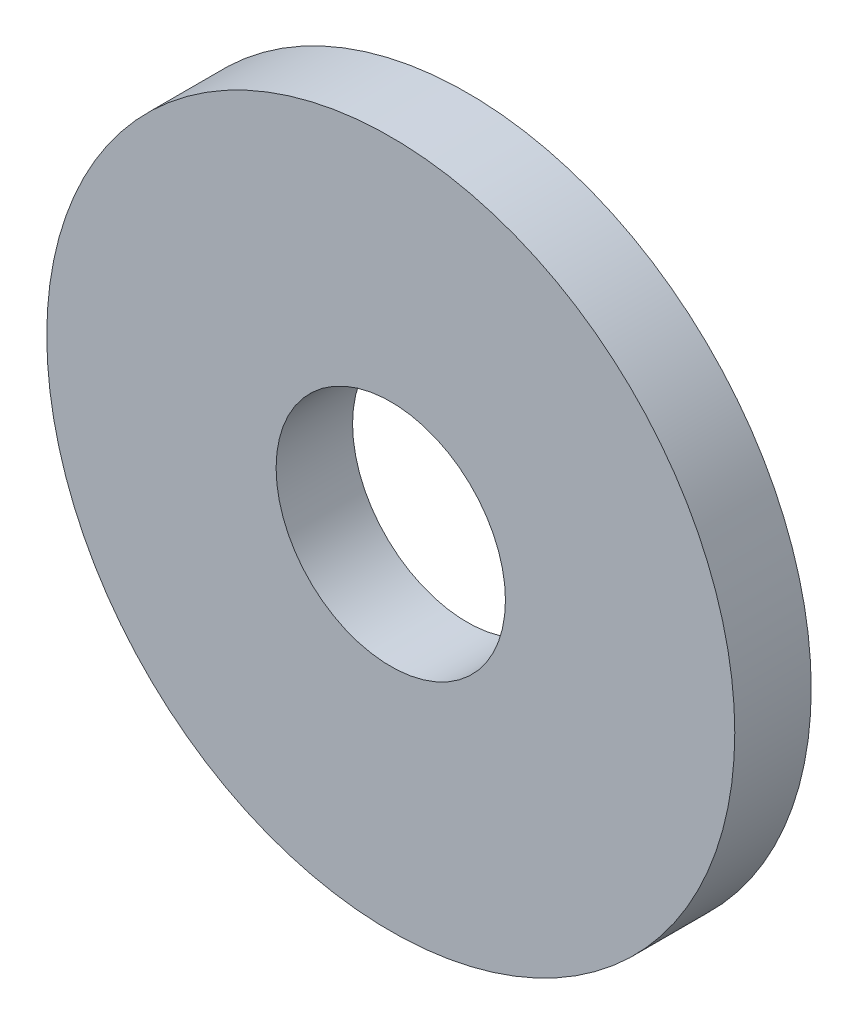
ISO-10303-21;
HEADER;
FILE_DESCRIPTION(('STEP AP214'),'2;1');
FILE_NAME('part.step','',(''),(''),'','','');
FILE_SCHEMA(('AUTOMOTIVE_DESIGN { 1 0 10303 214 1 1 1 1 }'));
ENDSEC;
DATA;
#1=APPLICATION_CONTEXT('core data for automotive mechanical design processes');
#2=APPLICATION_PROTOCOL_DEFINITION('international standard','automotive_design',2000,#1);
#3=PRODUCT_CONTEXT('',#1,'mechanical');
#4=PRODUCT('Part','Part','',(#3));
#5=PRODUCT_RELATED_PRODUCT_CATEGORY('part','',(#4));
#6=PRODUCT_DEFINITION_FORMATION('','',#4);
#7=PRODUCT_DEFINITION_CONTEXT('part definition',#1,'design');
#8=PRODUCT_DEFINITION('design','',#6,#7);
#9=PRODUCT_DEFINITION_SHAPE('','',#8);
#10=(LENGTH_UNIT() NAMED_UNIT(*) SI_UNIT(.MILLI.,.METRE.));
#11=(NAMED_UNIT(*) PLANE_ANGLE_UNIT() SI_UNIT($,.RADIAN.));
#12=(NAMED_UNIT(*) SI_UNIT($,.STERADIAN.) SOLID_ANGLE_UNIT());
#13=UNCERTAINTY_MEASURE_WITH_UNIT(LENGTH_MEASURE(1.E-05),#10,'distance_accuracy_value','');
#14=(GEOMETRIC_REPRESENTATION_CONTEXT(3) GLOBAL_UNCERTAINTY_ASSIGNED_CONTEXT((#13)) GLOBAL_UNIT_ASSIGNED_CONTEXT((#10,
#11,#12)) REPRESENTATION_CONTEXT('',''));
#15=CARTESIAN_POINT('',(0.,0.,0.));
#16=DIRECTION('',(0.,0.,1.));
#17=DIRECTION('',(1.,0.,0.));
#18=AXIS2_PLACEMENT_3D('',#15,#16,#17);
#19=CARTESIAN_POINT('',(0.,0.,0.5));
#20=DIRECTION('',(0.,0.,1.));
#21=DIRECTION('',(1.,0.,0.));
#22=AXIS2_PLACEMENT_3D('',#19,#20,#21);
#23=PLANE('',#22);
#24=CARTESIAN_POINT('',(0.,0.,0.5));
#25=DIRECTION('',(0.,0.,1.));
#26=DIRECTION('',(1.,0.,0.));
#27=AXIS2_PLACEMENT_3D('',#24,#25,#26);
#28=CIRCLE('',#27,4.5);
#29=CARTESIAN_POINT('',(4.5,0.,0.5));
#30=VERTEX_POINT('',#29);
#31=EDGE_CURVE('E10',#30,#30,#28,.T.);
#32=ORIENTED_EDGE('',*,*,#31,.T.);
#33=EDGE_LOOP('',(#32));
#34=FACE_BOUND('',#33,.T.);
#35=CARTESIAN_POINT('',(0.,0.,0.5));
#36=DIRECTION('',(0.,0.,1.));
#37=DIRECTION('',(1.,0.,0.));
#38=AXIS2_PLACEMENT_3D('',#35,#36,#37);
#39=CIRCLE('',#38,1.5);
#40=CARTESIAN_POINT('',(1.5,0.,0.5));
#41=VERTEX_POINT('',#40);
#42=EDGE_CURVE('E44',#41,#41,#39,.T.);
#43=ORIENTED_EDGE('',*,*,#42,.F.);
#44=EDGE_LOOP('',(#43));
#45=FACE_BOUND('',#44,.T.);
#46=ADVANCED_FACE('F33',(#34,#45),#23,.T.);
#47=CARTESIAN_POINT('',(0.,0.,-0.5));
#48=DIRECTION('',(0.,0.,1.));
#49=DIRECTION('',(1.,0.,0.));
#50=AXIS2_PLACEMENT_3D('',#47,#48,#49);
#51=PLANE('',#50);
#52=CARTESIAN_POINT('',(0.,0.,-0.5));
#53=DIRECTION('',(0.,0.,1.));
#54=DIRECTION('',(1.,0.,0.));
#55=AXIS2_PLACEMENT_3D('',#52,#53,#54);
#56=CIRCLE('',#55,4.5);
#57=CARTESIAN_POINT('',(4.5,0.,-0.5));
#58=VERTEX_POINT('',#57);
#59=EDGE_CURVE('E37',#58,#58,#56,.T.);
#60=ORIENTED_EDGE('',*,*,#59,.F.);
#61=EDGE_LOOP('',(#60));
#62=FACE_BOUND('',#61,.T.);
#63=CARTESIAN_POINT('',(0.,0.,-0.5));
#64=DIRECTION('',(0.,0.,1.));
#65=DIRECTION('',(1.,0.,0.));
#66=AXIS2_PLACEMENT_3D('',#63,#64,#65);
#67=CIRCLE('',#66,1.5);
#68=CARTESIAN_POINT('',(1.5,0.,-0.5));
#69=VERTEX_POINT('',#68);
#70=EDGE_CURVE('E46',#69,#69,#67,.T.);
#71=ORIENTED_EDGE('',*,*,#70,.T.);
#72=EDGE_LOOP('',(#71));
#73=FACE_BOUND('',#72,.T.);
#74=ADVANCED_FACE('F56',(#62,#73),#51,.F.);
#75=CARTESIAN_POINT('',(0.,0.,0.5));
#76=DIRECTION('',(0.,0.,-1.));
#77=DIRECTION('',(-1.,0.,0.));
#78=AXIS2_PLACEMENT_3D('',#75,#76,#77);
#79=CYLINDRICAL_SURFACE('',#78,4.5);
#80=ORIENTED_EDGE('',*,*,#31,.F.);
#81=EDGE_LOOP('',(#80));
#82=FACE_BOUND('',#81,.T.);
#83=ORIENTED_EDGE('',*,*,#59,.T.);
#84=EDGE_LOOP('',(#83));
#85=FACE_BOUND('',#84,.T.);
#86=ADVANCED_FACE('F35',(#82,#85),#79,.T.);
#87=CARTESIAN_POINT('',(0.,0.,0.5));
#88=DIRECTION('',(0.,0.,-1.));
#89=DIRECTION('',(-1.,0.,0.));
#90=AXIS2_PLACEMENT_3D('',#87,#88,#89);
#91=CYLINDRICAL_SURFACE('',#90,1.5);
#92=ORIENTED_EDGE('',*,*,#42,.T.);
#93=EDGE_LOOP('',(#92));
#94=FACE_BOUND('',#93,.T.);
#95=ORIENTED_EDGE('',*,*,#70,.F.);
#96=EDGE_LOOP('',(#95));
#97=FACE_BOUND('',#96,.T.);
#98=ADVANCED_FACE('F52',(#94,#97),#91,.F.);
#99=CLOSED_SHELL('',(#46,#74,#86,#98));
#100=MANIFOLD_SOLID_BREP('B2',#99);
#101=ADVANCED_BREP_SHAPE_REPRESENTATION('',(#18,#100),#14);
#102=SHAPE_DEFINITION_REPRESENTATION(#9,#101);
ENDSEC;
END-ISO-10303-21;
